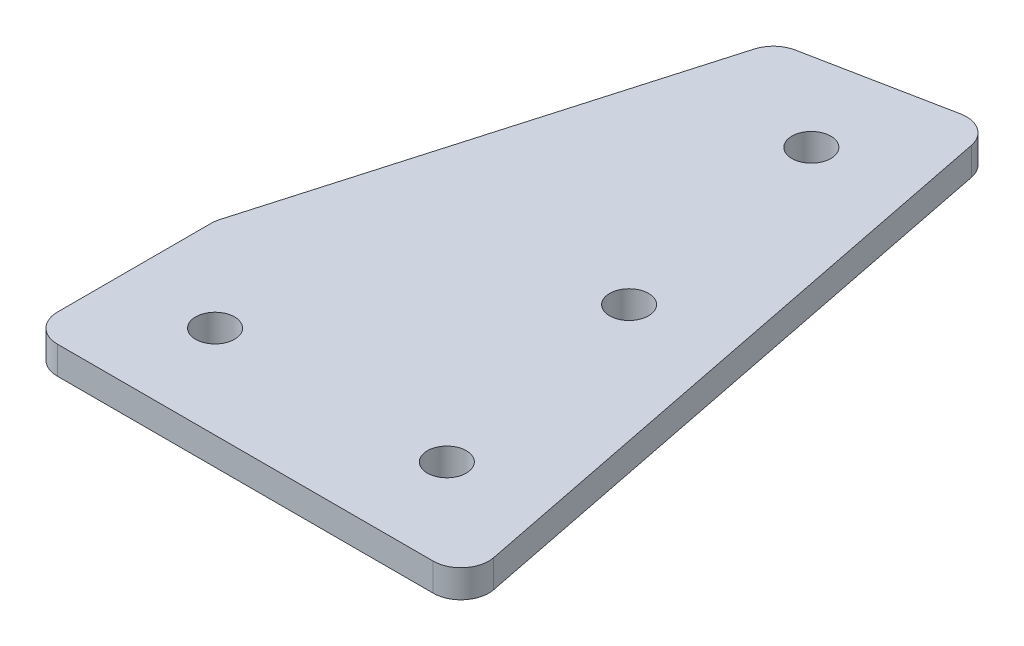
ISO-10303-21;
HEADER;
FILE_DESCRIPTION(('STEP AP214'),'2;1');
FILE_NAME('part.step','',(''),(''),'','','');
FILE_SCHEMA(('AUTOMOTIVE_DESIGN { 1 0 10303 214 1 1 1 1 }'));
ENDSEC;
DATA;
#1=APPLICATION_CONTEXT('core data for automotive mechanical design processes');
#2=APPLICATION_PROTOCOL_DEFINITION('international standard','automotive_design',2000,#1);
#3=PRODUCT_CONTEXT('',#1,'mechanical');
#4=PRODUCT('Part','Part','',(#3));
#5=PRODUCT_RELATED_PRODUCT_CATEGORY('part','',(#4));
#6=PRODUCT_DEFINITION_FORMATION('','',#4);
#7=PRODUCT_DEFINITION_CONTEXT('part definition',#1,'design');
#8=PRODUCT_DEFINITION('design','',#6,#7);
#9=PRODUCT_DEFINITION_SHAPE('','',#8);
#10=(LENGTH_UNIT() NAMED_UNIT(*) SI_UNIT(.MILLI.,.METRE.));
#11=(NAMED_UNIT(*) PLANE_ANGLE_UNIT() SI_UNIT($,.RADIAN.));
#12=(NAMED_UNIT(*) SI_UNIT($,.STERADIAN.) SOLID_ANGLE_UNIT());
#13=UNCERTAINTY_MEASURE_WITH_UNIT(LENGTH_MEASURE(1.E-05),#10,'distance_accuracy_value','');
#14=(GEOMETRIC_REPRESENTATION_CONTEXT(3) GLOBAL_UNCERTAINTY_ASSIGNED_CONTEXT((#13)) GLOBAL_UNIT_ASSIGNED_CONTEXT((#10,
#11,#12)) REPRESENTATION_CONTEXT('',''));
#15=CARTESIAN_POINT('',(0.,0.,0.));
#16=DIRECTION('',(0.,0.,1.));
#17=DIRECTION('',(1.,0.,0.));
#18=AXIS2_PLACEMENT_3D('',#15,#16,#17);
#19=CARTESIAN_POINT('',(9.80887295008376,3.,-1.94576757325093));
#20=DIRECTION('',(-0.980887295008377,0.,0.194576757325094));
#21=DIRECTION('',(0.194576757325094,0.,0.980887295008377));
#22=AXIS2_PLACEMENT_3D('',#19,#20,#21);
#23=PLANE('',#22);
#24=DIRECTION('',(-0.194576757325094,0.,-0.980887295008377));
#25=VECTOR('',#24,1.);
#26=CARTESIAN_POINT('',(9.80887295008376,3.,-1.94576757325093));
#27=LINE('',#26,#25);
#28=CARTESIAN_POINT('',(11.4676344724254,3.,6.41626972802472));
#29=VERTEX_POINT('',#28);
#30=CARTESIAN_POINT('',(-1.28200221744658,3.,-57.8563433887284));
#31=VERTEX_POINT('',#30);
#32=EDGE_CURVE('E138',#29,#31,#27,.T.);
#33=ORIENTED_EDGE('',*,*,#32,.F.);
#34=DIRECTION('',(0.,-1.,0.));
#35=VECTOR('',#34,1.);
#36=CARTESIAN_POINT('',(11.4676344724254,3.,6.41626972802472));
#37=LINE('',#36,#35);
#38=CARTESIAN_POINT('',(11.4676344724254,0.,6.41626972802472));
#39=VERTEX_POINT('',#38);
#40=EDGE_CURVE('E123',#29,#39,#37,.T.);
#41=ORIENTED_EDGE('',*,*,#40,.T.);
#42=DIRECTION('',(-0.194576757325094,0.,-0.980887295008377));
#43=VECTOR('',#42,1.);
#44=CARTESIAN_POINT('',(9.80887295008376,0.,-1.94576757325093));
#45=LINE('',#44,#43);
#46=CARTESIAN_POINT('',(-1.28200221744658,0.,-57.8563433887284));
#47=VERTEX_POINT('',#46);
#48=EDGE_CURVE('E135',#39,#47,#45,.T.);
#49=ORIENTED_EDGE('',*,*,#48,.T.);
#50=DIRECTION('',(0.,-1.,0.));
#51=VECTOR('',#50,1.);
#52=CARTESIAN_POINT('',(-1.28200221744658,3.,-57.8563433887284));
#53=LINE('',#52,#51);
#54=EDGE_CURVE('E140',#47,#31,#53,.F.);
#55=ORIENTED_EDGE('',*,*,#54,.T.);
#56=EDGE_LOOP('',(#33,#41,#49,#55));
#57=FACE_BOUND('',#56,.T.);
#58=ADVANCED_FACE('F41',(#57),#23,.F.);
#59=CARTESIAN_POINT('',(-11.6746054395056,3.,-58.8532377005026));
#60=DIRECTION('',(0.194576757325094,0.,0.980887295008377));
#61=DIRECTION('',(0.980887295008377,0.,-0.194576757325094));
#62=AXIS2_PLACEMENT_3D('',#59,#60,#61);
#63=PLANE('',#62);
#64=DIRECTION('',(-0.980887295008377,0.,0.194576757325094));
#65=VECTOR('',#64,1.);
#66=CARTESIAN_POINT('',(-11.6746054395056,0.,-58.8532377005026));
#67=LINE('',#66,#65);
#68=CARTESIAN_POINT('',(-4.808394374447,0.,-60.2152750017783));
#69=VERTEX_POINT('',#68);
#70=CARTESIAN_POINT('',(-19.6905986844829,0.,-57.2631202830533));
#71=VERTEX_POINT('',#70);
#72=EDGE_CURVE('E145',#69,#71,#67,.T.);
#73=ORIENTED_EDGE('',*,*,#72,.T.);
#74=DIRECTION('',(0.,-1.,0.));
#75=VECTOR('',#74,1.);
#76=CARTESIAN_POINT('',(-19.6905986844829,3.,-57.2631202830533));
#77=LINE('',#76,#75);
#78=CARTESIAN_POINT('',(-19.6905986844829,3.,-57.2631202830533));
#79=VERTEX_POINT('',#78);
#80=EDGE_CURVE('E11',#71,#79,#77,.F.);
#81=ORIENTED_EDGE('',*,*,#80,.T.);
#82=DIRECTION('',(-0.980887295008377,0.,0.194576757325094));
#83=VECTOR('',#82,1.);
#84=CARTESIAN_POINT('',(-11.6746054395056,3.,-58.8532377005026));
#85=LINE('',#84,#83);
#86=CARTESIAN_POINT('',(-4.808394374447,3.,-60.2152750017783));
#87=VERTEX_POINT('',#86);
#88=EDGE_CURVE('E204',#87,#79,#85,.T.);
#89=ORIENTED_EDGE('',*,*,#88,.F.);
#90=DIRECTION('',(0.,-1.,0.));
#91=VECTOR('',#90,1.);
#92=CARTESIAN_POINT('',(-4.808394374447,3.,-60.2152750017783));
#93=LINE('',#92,#91);
#94=EDGE_CURVE('E49',#87,#69,#93,.T.);
#95=ORIENTED_EDGE('',*,*,#94,.T.);
#96=EDGE_LOOP('',(#73,#81,#89,#95));
#97=FACE_BOUND('',#96,.T.);
#98=ADVANCED_FACE('F201',(#97),#63,.F.);
#99=CARTESIAN_POINT('',(-34.9772916586416,3.,-10.0788065801698));
#100=DIRECTION('',(0.960902540461166,0.,0.276886813942587));
#101=DIRECTION('',(0.276886813942587,0.,-0.960902540461166));
#102=AXIS2_PLACEMENT_3D('',#99,#100,#101);
#103=PLANE('',#102);
#104=DIRECTION('',(-0.276886813942587,0.,0.960902540461166));
#105=VECTOR('',#104,1.);
#106=CARTESIAN_POINT('',(-34.9772916586416,0.,-10.0788065801698));
#107=LINE('',#106,#105);
#108=CARTESIAN_POINT('',(-21.9895760338912,0.,-55.151118839856));
#109=VERTEX_POINT('',#108);
#110=CARTESIAN_POINT('',(-34.8827076213835,0.,-10.407049158407));
#111=VERTEX_POINT('',#110);
#112=EDGE_CURVE('E149',#109,#111,#107,.T.);
#113=ORIENTED_EDGE('',*,*,#112,.T.);
#114=DIRECTION('',(0.,-1.,0.));
#115=VECTOR('',#114,1.);
#116=CARTESIAN_POINT('',(-34.8827076213835,3.,-10.407049158407));
#117=LINE('',#116,#115);
#118=CARTESIAN_POINT('',(-34.8827076213835,3.,-10.407049158407));
#119=VERTEX_POINT('',#118);
#120=EDGE_CURVE('E196',#111,#119,#117,.F.);
#121=ORIENTED_EDGE('',*,*,#120,.T.);
#122=DIRECTION('',(-0.276886813942587,0.,0.960902540461166));
#123=VECTOR('',#122,1.);
#124=CARTESIAN_POINT('',(-34.9772916586416,3.,-10.0788065801698));
#125=LINE('',#124,#123);
#126=CARTESIAN_POINT('',(-21.9895760338912,3.,-55.151118839856));
#127=VERTEX_POINT('',#126);
#128=EDGE_CURVE('E216',#127,#119,#125,.T.);
#129=ORIENTED_EDGE('',*,*,#128,.F.);
#130=DIRECTION('',(0.,-1.,0.));
#131=VECTOR('',#130,1.);
#132=CARTESIAN_POINT('',(-21.9895760338912,3.,-55.151118839856));
#133=LINE('',#132,#131);
#134=EDGE_CURVE('E193',#127,#109,#133,.T.);
#135=ORIENTED_EDGE('',*,*,#134,.T.);
#136=EDGE_LOOP('',(#113,#121,#129,#135));
#137=FACE_BOUND('',#136,.T.);
#138=ADVANCED_FACE('F214',(#137),#103,.F.);
#139=CARTESIAN_POINT('',(-35.,3.,0.));
#140=DIRECTION('',(1.,0.,0.));
#141=DIRECTION('',(0.,0.,-1.));
#142=AXIS2_PLACEMENT_3D('',#139,#140,#141);
#143=PLANE('',#142);
#144=DIRECTION('',(0.,0.,1.));
#145=VECTOR('',#144,1.);
#146=CARTESIAN_POINT('',(-35.,0.,0.));
#147=LINE('',#146,#145);
#148=CARTESIAN_POINT('',(-35.,0.,-9.57638871657927));
#149=VERTEX_POINT('',#148);
#150=CARTESIAN_POINT('',(-35.,0.,7.));
#151=VERTEX_POINT('',#150);
#152=EDGE_CURVE('E158',#149,#151,#147,.T.);
#153=ORIENTED_EDGE('',*,*,#152,.T.);
#154=DIRECTION('',(0.,-1.,0.));
#155=VECTOR('',#154,1.);
#156=CARTESIAN_POINT('',(-35.,3.,7.));
#157=LINE('',#156,#155);
#158=CARTESIAN_POINT('',(-35.,3.,7.));
#159=VERTEX_POINT('',#158);
#160=EDGE_CURVE('E56',#151,#159,#157,.F.);
#161=ORIENTED_EDGE('',*,*,#160,.T.);
#162=DIRECTION('',(0.,0.,1.));
#163=VECTOR('',#162,1.);
#164=CARTESIAN_POINT('',(-35.,3.,0.));
#165=LINE('',#164,#163);
#166=CARTESIAN_POINT('',(-35.,3.,-9.57638871657927));
#167=VERTEX_POINT('',#166);
#168=EDGE_CURVE('E217',#167,#159,#165,.T.);
#169=ORIENTED_EDGE('',*,*,#168,.F.);
#170=DIRECTION('',(0.,-1.,0.));
#171=VECTOR('',#170,1.);
#172=CARTESIAN_POINT('',(-35.,3.,-9.57638871657927));
#173=LINE('',#172,#171);
#174=EDGE_CURVE('E189',#167,#149,#173,.T.);
#175=ORIENTED_EDGE('',*,*,#174,.T.);
#176=EDGE_LOOP('',(#153,#161,#169,#175));
#177=FACE_BOUND('',#176,.T.);
#178=ADVANCED_FACE('F262',(#177),#143,.F.);
#179=CARTESIAN_POINT('',(-25.,3.,0.));
#180=DIRECTION('',(0.,-1.,0.));
#181=DIRECTION('',(0.,0.,-1.));
#182=AXIS2_PLACEMENT_3D('',#179,#180,#181);
#183=CYLINDRICAL_SURFACE('',#182,2.1);
#184=CARTESIAN_POINT('',(-25.,3.,0.));
#185=DIRECTION('',(0.,1.,0.));
#186=DIRECTION('',(0.,0.,1.));
#187=AXIS2_PLACEMENT_3D('',#184,#185,#186);
#188=CIRCLE('',#187,2.1);
#189=CARTESIAN_POINT('',(-25.,3.,2.1));
#190=VERTEX_POINT('',#189);
#191=EDGE_CURVE('E226',#190,#190,#188,.T.);
#192=ORIENTED_EDGE('',*,*,#191,.T.);
#193=EDGE_LOOP('',(#192));
#194=FACE_BOUND('',#193,.T.);
#195=CARTESIAN_POINT('',(-25.,0.,0.));
#196=DIRECTION('',(0.,1.,0.));
#197=DIRECTION('',(0.,0.,1.));
#198=AXIS2_PLACEMENT_3D('',#195,#196,#197);
#199=CIRCLE('',#198,2.1);
#200=CARTESIAN_POINT('',(-25.,0.,2.1));
#201=VERTEX_POINT('',#200);
#202=EDGE_CURVE('E162',#201,#201,#199,.T.);
#203=ORIENTED_EDGE('',*,*,#202,.F.);
#204=EDGE_LOOP('',(#203));
#205=FACE_BOUND('',#204,.T.);
#206=ADVANCED_FACE('F265',(#194,#205),#183,.F.);
#207=CARTESIAN_POINT('',(0.,3.,10.));
#208=DIRECTION('',(0.,0.,-1.));
#209=DIRECTION('',(-1.,0.,0.));
#210=AXIS2_PLACEMENT_3D('',#207,#208,#209);
#211=PLANE('',#210);
#212=DIRECTION('',(1.,0.,0.));
#213=VECTOR('',#212,1.);
#214=CARTESIAN_POINT('',(0.,0.,10.));
#215=LINE('',#214,#213);
#216=CARTESIAN_POINT('',(-32.,0.,10.));
#217=VERTEX_POINT('',#216);
#218=CARTESIAN_POINT('',(8.52497258740029,0.,10.));
#219=VERTEX_POINT('',#218);
#220=EDGE_CURVE('E160',#217,#219,#215,.T.);
#221=ORIENTED_EDGE('',*,*,#220,.T.);
#222=DIRECTION('',(0.,-1.,0.));
#223=VECTOR('',#222,1.);
#224=CARTESIAN_POINT('',(8.52497258740029,3.,10.));
#225=LINE('',#224,#223);
#226=CARTESIAN_POINT('',(8.52497258740029,3.,10.));
#227=VERTEX_POINT('',#226);
#228=EDGE_CURVE('E124',#219,#227,#225,.F.);
#229=ORIENTED_EDGE('',*,*,#228,.T.);
#230=DIRECTION('',(1.,0.,0.));
#231=VECTOR('',#230,1.);
#232=CARTESIAN_POINT('',(0.,3.,10.));
#233=LINE('',#232,#231);
#234=CARTESIAN_POINT('',(-32.,3.,10.));
#235=VERTEX_POINT('',#234);
#236=EDGE_CURVE('E219',#235,#227,#233,.T.);
#237=ORIENTED_EDGE('',*,*,#236,.F.);
#238=DIRECTION('',(0.,-1.,0.));
#239=VECTOR('',#238,1.);
#240=CARTESIAN_POINT('',(-32.,3.,10.));
#241=LINE('',#240,#239);
#242=EDGE_CURVE('E129',#235,#217,#241,.T.);
#243=ORIENTED_EDGE('',*,*,#242,.T.);
#244=EDGE_LOOP('',(#221,#229,#237,#243));
#245=FACE_BOUND('',#244,.T.);
#246=ADVANCED_FACE('F248',(#245),#211,.F.);
#247=CARTESIAN_POINT('',(-4.86441893312735,3.,-24.5221823752094));
#248=DIRECTION('',(0.,-1.,0.));
#249=DIRECTION('',(0.,0.,-1.));
#250=AXIS2_PLACEMENT_3D('',#247,#248,#249);
#251=CYLINDRICAL_SURFACE('',#250,2.1);
#252=CARTESIAN_POINT('',(-4.86441893312735,3.,-24.5221823752094));
#253=DIRECTION('',(0.,1.,0.));
#254=DIRECTION('',(0.,0.,1.));
#255=AXIS2_PLACEMENT_3D('',#252,#253,#254);
#256=CIRCLE('',#255,2.1);
#257=CARTESIAN_POINT('',(-4.86441893312735,3.,-22.4221823752094));
#258=VERTEX_POINT('',#257);
#259=EDGE_CURVE('E282',#258,#258,#256,.T.);
#260=ORIENTED_EDGE('',*,*,#259,.T.);
#261=EDGE_LOOP('',(#260));
#262=FACE_BOUND('',#261,.T.);
#263=CARTESIAN_POINT('',(-4.86441893312735,0.,-24.5221823752094));
#264=DIRECTION('',(0.,1.,0.));
#265=DIRECTION('',(0.,0.,1.));
#266=AXIS2_PLACEMENT_3D('',#263,#264,#265);
#267=CIRCLE('',#266,2.1);
#268=CARTESIAN_POINT('',(-4.86441893312735,0.,-22.4221823752094));
#269=VERTEX_POINT('',#268);
#270=EDGE_CURVE('E146',#269,#269,#267,.T.);
#271=ORIENTED_EDGE('',*,*,#270,.F.);
#272=EDGE_LOOP('',(#271));
#273=FACE_BOUND('',#272,.T.);
#274=ADVANCED_FACE('F238',(#262,#273),#251,.F.);
#275=CARTESIAN_POINT('',(-9.7288378662547,3.,-49.0443647504189));
#276=DIRECTION('',(0.,-1.,0.));
#277=DIRECTION('',(0.,0.,-1.));
#278=AXIS2_PLACEMENT_3D('',#275,#276,#277);
#279=CYLINDRICAL_SURFACE('',#278,2.1);
#280=CARTESIAN_POINT('',(-9.7288378662547,3.,-49.0443647504189));
#281=DIRECTION('',(0.,1.,0.));
#282=DIRECTION('',(0.,0.,1.));
#283=AXIS2_PLACEMENT_3D('',#280,#281,#282);
#284=CIRCLE('',#283,2.1);
#285=CARTESIAN_POINT('',(-9.7288378662547,3.,-46.9443647504189));
#286=VERTEX_POINT('',#285);
#287=EDGE_CURVE('E168',#286,#286,#284,.T.);
#288=ORIENTED_EDGE('',*,*,#287,.T.);
#289=EDGE_LOOP('',(#288));
#290=FACE_BOUND('',#289,.T.);
#291=CARTESIAN_POINT('',(-9.7288378662547,0.,-49.0443647504189));
#292=DIRECTION('',(0.,1.,0.));
#293=DIRECTION('',(0.,0.,1.));
#294=AXIS2_PLACEMENT_3D('',#291,#292,#293);
#295=CIRCLE('',#294,2.1);
#296=CARTESIAN_POINT('',(-9.7288378662547,0.,-46.9443647504189));
#297=VERTEX_POINT('',#296);
#298=EDGE_CURVE('E152',#297,#297,#295,.T.);
#299=ORIENTED_EDGE('',*,*,#298,.F.);
#300=EDGE_LOOP('',(#299));
#301=FACE_BOUND('',#300,.T.);
#302=ADVANCED_FACE('F235',(#290,#301),#279,.F.);
#303=CARTESIAN_POINT('',(0.,3.,0.));
#304=DIRECTION('',(0.,-1.,0.));
#305=DIRECTION('',(0.,0.,-1.));
#306=AXIS2_PLACEMENT_3D('',#303,#304,#305);
#307=CYLINDRICAL_SURFACE('',#306,2.1);
#308=CARTESIAN_POINT('',(0.,3.,0.));
#309=DIRECTION('',(0.,1.,0.));
#310=DIRECTION('',(0.,0.,1.));
#311=AXIS2_PLACEMENT_3D('',#308,#309,#310);
#312=CIRCLE('',#311,2.1);
#313=CARTESIAN_POINT('',(0.,3.,2.1));
#314=VERTEX_POINT('',#313);
#315=EDGE_CURVE('E169',#314,#314,#312,.T.);
#316=ORIENTED_EDGE('',*,*,#315,.T.);
#317=EDGE_LOOP('',(#316));
#318=FACE_BOUND('',#317,.T.);
#319=CARTESIAN_POINT('',(0.,0.,0.));
#320=DIRECTION('',(0.,1.,0.));
#321=DIRECTION('',(0.,0.,1.));
#322=AXIS2_PLACEMENT_3D('',#319,#320,#321);
#323=CIRCLE('',#322,2.1);
#324=CARTESIAN_POINT('',(0.,0.,2.1));
#325=VERTEX_POINT('',#324);
#326=EDGE_CURVE('E165',#325,#325,#323,.T.);
#327=ORIENTED_EDGE('',*,*,#326,.F.);
#328=EDGE_LOOP('',(#327));
#329=FACE_BOUND('',#328,.T.);
#330=ADVANCED_FACE('F237',(#318,#329),#307,.F.);
#331=CARTESIAN_POINT('',(0.,3.,0.));
#332=DIRECTION('',(0.,1.,0.));
#333=DIRECTION('',(0.,0.,1.));
#334=AXIS2_PLACEMENT_3D('',#331,#332,#333);
#335=PLANE('',#334);
#336=ORIENTED_EDGE('',*,*,#287,.F.);
#337=EDGE_LOOP('',(#336));
#338=FACE_BOUND('',#337,.T.);
#339=ORIENTED_EDGE('',*,*,#259,.F.);
#340=EDGE_LOOP('',(#339));
#341=FACE_BOUND('',#340,.T.);
#342=ORIENTED_EDGE('',*,*,#236,.T.);
#343=CARTESIAN_POINT('',(8.52497258740029,3.,7.));
#344=DIRECTION('',(0.,1.,0.));
#345=DIRECTION('',(0.,0.,1.));
#346=AXIS2_PLACEMENT_3D('',#343,#344,#345);
#347=CIRCLE('',#346,3.);
#348=EDGE_CURVE('E187',#227,#29,#347,.T.);
#349=ORIENTED_EDGE('',*,*,#348,.T.);
#350=ORIENTED_EDGE('',*,*,#32,.T.);
#351=CARTESIAN_POINT('',(-4.22466410247172,3.,-57.2726131167532));
#352=DIRECTION('',(0.,1.,0.));
#353=DIRECTION('',(0.,0.,1.));
#354=AXIS2_PLACEMENT_3D('',#351,#352,#353);
#355=CIRCLE('',#354,3.);
#356=EDGE_CURVE('E180',#31,#87,#355,.T.);
#357=ORIENTED_EDGE('',*,*,#356,.T.);
#358=ORIENTED_EDGE('',*,*,#88,.T.);
#359=CARTESIAN_POINT('',(-19.1068684125077,3.,-54.3204583980282));
#360=DIRECTION('',(0.,1.,0.));
#361=DIRECTION('',(0.,0.,1.));
#362=AXIS2_PLACEMENT_3D('',#359,#360,#361);
#363=CIRCLE('',#362,3.);
#364=EDGE_CURVE('E182',#79,#127,#363,.T.);
#365=ORIENTED_EDGE('',*,*,#364,.T.);
#366=ORIENTED_EDGE('',*,*,#128,.T.);
#367=CARTESIAN_POINT('',(-32.,3.,-9.57638871657927));
#368=DIRECTION('',(0.,1.,0.));
#369=DIRECTION('',(0.,0.,1.));
#370=AXIS2_PLACEMENT_3D('',#367,#368,#369);
#371=CIRCLE('',#370,3.);
#372=EDGE_CURVE('E63',#119,#167,#371,.T.);
#373=ORIENTED_EDGE('',*,*,#372,.T.);
#374=ORIENTED_EDGE('',*,*,#168,.T.);
#375=CARTESIAN_POINT('',(-32.,3.,7.));
#376=DIRECTION('',(0.,1.,0.));
#377=DIRECTION('',(0.,0.,1.));
#378=AXIS2_PLACEMENT_3D('',#375,#376,#377);
#379=CIRCLE('',#378,3.);
#380=EDGE_CURVE('E185',#159,#235,#379,.T.);
#381=ORIENTED_EDGE('',*,*,#380,.T.);
#382=EDGE_LOOP('',(#342,#349,#350,#357,#358,#365,#366,#373,#374,#381));
#383=FACE_BOUND('',#382,.T.);
#384=ORIENTED_EDGE('',*,*,#191,.F.);
#385=EDGE_LOOP('',(#384));
#386=FACE_BOUND('',#385,.T.);
#387=ORIENTED_EDGE('',*,*,#315,.F.);
#388=EDGE_LOOP('',(#387));
#389=FACE_BOUND('',#388,.T.);
#390=ADVANCED_FACE('F245',(#338,#341,#383,#386,#389),#335,.T.);
#391=CARTESIAN_POINT('',(0.,0.,0.));
#392=DIRECTION('',(0.,1.,0.));
#393=DIRECTION('',(0.,0.,1.));
#394=AXIS2_PLACEMENT_3D('',#391,#392,#393);
#395=PLANE('',#394);
#396=ORIENTED_EDGE('',*,*,#298,.T.);
#397=EDGE_LOOP('',(#396));
#398=FACE_BOUND('',#397,.T.);
#399=ORIENTED_EDGE('',*,*,#270,.T.);
#400=EDGE_LOOP('',(#399));
#401=FACE_BOUND('',#400,.T.);
#402=ORIENTED_EDGE('',*,*,#48,.F.);
#403=CARTESIAN_POINT('',(8.52497258740029,0.,7.));
#404=DIRECTION('',(0.,1.,0.));
#405=DIRECTION('',(0.,0.,1.));
#406=AXIS2_PLACEMENT_3D('',#403,#404,#405);
#407=CIRCLE('',#406,3.);
#408=EDGE_CURVE('E119',#39,#219,#407,.F.);
#409=ORIENTED_EDGE('',*,*,#408,.T.);
#410=ORIENTED_EDGE('',*,*,#220,.F.);
#411=CARTESIAN_POINT('',(-32.,0.,7.));
#412=DIRECTION('',(0.,1.,0.));
#413=DIRECTION('',(0.,0.,1.));
#414=AXIS2_PLACEMENT_3D('',#411,#412,#413);
#415=CIRCLE('',#414,3.);
#416=EDGE_CURVE('E130',#217,#151,#415,.F.);
#417=ORIENTED_EDGE('',*,*,#416,.T.);
#418=ORIENTED_EDGE('',*,*,#152,.F.);
#419=CARTESIAN_POINT('',(-32.,0.,-9.57638871657927));
#420=DIRECTION('',(0.,1.,0.));
#421=DIRECTION('',(0.,0.,1.));
#422=AXIS2_PLACEMENT_3D('',#419,#420,#421);
#423=CIRCLE('',#422,3.);
#424=EDGE_CURVE('E174',#149,#111,#423,.F.);
#425=ORIENTED_EDGE('',*,*,#424,.T.);
#426=ORIENTED_EDGE('',*,*,#112,.F.);
#427=CARTESIAN_POINT('',(-19.1068684125077,0.,-54.3204583980282));
#428=DIRECTION('',(0.,1.,0.));
#429=DIRECTION('',(0.,0.,1.));
#430=AXIS2_PLACEMENT_3D('',#427,#428,#429);
#431=CIRCLE('',#430,3.);
#432=EDGE_CURVE('E172',#109,#71,#431,.F.);
#433=ORIENTED_EDGE('',*,*,#432,.T.);
#434=ORIENTED_EDGE('',*,*,#72,.F.);
#435=CARTESIAN_POINT('',(-4.22466410247172,0.,-57.2726131167532));
#436=DIRECTION('',(0.,1.,0.));
#437=DIRECTION('',(0.,0.,1.));
#438=AXIS2_PLACEMENT_3D('',#435,#436,#437);
#439=CIRCLE('',#438,3.);
#440=EDGE_CURVE('E139',#69,#47,#439,.F.);
#441=ORIENTED_EDGE('',*,*,#440,.T.);
#442=EDGE_LOOP('',(#402,#409,#410,#417,#418,#425,#426,#433,#434,#441));
#443=FACE_BOUND('',#442,.T.);
#444=ORIENTED_EDGE('',*,*,#202,.T.);
#445=EDGE_LOOP('',(#444));
#446=FACE_BOUND('',#445,.T.);
#447=ORIENTED_EDGE('',*,*,#326,.T.);
#448=EDGE_LOOP('',(#447));
#449=FACE_BOUND('',#448,.T.);
#450=ADVANCED_FACE('F142',(#398,#401,#443,#446,#449),#395,.F.);
#451=CARTESIAN_POINT('',(8.52497258740029,3.,7.));
#452=DIRECTION('',(0.,-1.,0.));
#453=DIRECTION('',(0.,0.,-1.));
#454=AXIS2_PLACEMENT_3D('',#451,#452,#453);
#455=CYLINDRICAL_SURFACE('',#454,3.);
#456=ORIENTED_EDGE('',*,*,#348,.F.);
#457=ORIENTED_EDGE('',*,*,#228,.F.);
#458=ORIENTED_EDGE('',*,*,#408,.F.);
#459=ORIENTED_EDGE('',*,*,#40,.F.);
#460=EDGE_LOOP('',(#456,#457,#458,#459));
#461=FACE_BOUND('',#460,.T.);
#462=ADVANCED_FACE('F122',(#461),#455,.T.);
#463=CARTESIAN_POINT('',(-32.,3.,7.));
#464=DIRECTION('',(0.,-1.,0.));
#465=DIRECTION('',(0.,0.,-1.));
#466=AXIS2_PLACEMENT_3D('',#463,#464,#465);
#467=CYLINDRICAL_SURFACE('',#466,3.);
#468=ORIENTED_EDGE('',*,*,#380,.F.);
#469=ORIENTED_EDGE('',*,*,#160,.F.);
#470=ORIENTED_EDGE('',*,*,#416,.F.);
#471=ORIENTED_EDGE('',*,*,#242,.F.);
#472=EDGE_LOOP('',(#468,#469,#470,#471));
#473=FACE_BOUND('',#472,.T.);
#474=ADVANCED_FACE('F296',(#473),#467,.T.);
#475=CARTESIAN_POINT('',(-32.,3.,-9.57638871657927));
#476=DIRECTION('',(0.,-1.,0.));
#477=DIRECTION('',(0.,0.,-1.));
#478=AXIS2_PLACEMENT_3D('',#475,#476,#477);
#479=CYLINDRICAL_SURFACE('',#478,3.);
#480=ORIENTED_EDGE('',*,*,#372,.F.);
#481=ORIENTED_EDGE('',*,*,#120,.F.);
#482=ORIENTED_EDGE('',*,*,#424,.F.);
#483=ORIENTED_EDGE('',*,*,#174,.F.);
#484=EDGE_LOOP('',(#480,#481,#482,#483));
#485=FACE_BOUND('',#484,.T.);
#486=ADVANCED_FACE('F300',(#485),#479,.T.);
#487=CARTESIAN_POINT('',(-19.1068684125077,3.,-54.3204583980282));
#488=DIRECTION('',(0.,-1.,0.));
#489=DIRECTION('',(0.,0.,-1.));
#490=AXIS2_PLACEMENT_3D('',#487,#488,#489);
#491=CYLINDRICAL_SURFACE('',#490,3.);
#492=ORIENTED_EDGE('',*,*,#364,.F.);
#493=ORIENTED_EDGE('',*,*,#80,.F.);
#494=ORIENTED_EDGE('',*,*,#432,.F.);
#495=ORIENTED_EDGE('',*,*,#134,.F.);
#496=EDGE_LOOP('',(#492,#493,#494,#495));
#497=FACE_BOUND('',#496,.T.);
#498=ADVANCED_FACE('F211',(#497),#491,.T.);
#499=CARTESIAN_POINT('',(-4.22466410247172,3.,-57.2726131167532));
#500=DIRECTION('',(0.,-1.,0.));
#501=DIRECTION('',(0.,0.,-1.));
#502=AXIS2_PLACEMENT_3D('',#499,#500,#501);
#503=CYLINDRICAL_SURFACE('',#502,3.);
#504=ORIENTED_EDGE('',*,*,#356,.F.);
#505=ORIENTED_EDGE('',*,*,#54,.F.);
#506=ORIENTED_EDGE('',*,*,#440,.F.);
#507=ORIENTED_EDGE('',*,*,#94,.F.);
#508=EDGE_LOOP('',(#504,#505,#506,#507));
#509=FACE_BOUND('',#508,.T.);
#510=ADVANCED_FACE('F43',(#509),#503,.T.);
#511=CLOSED_SHELL('',(#58,#98,#138,#178,#206,#246,#274,#302,#330,#390,#450,#462,#474,#486,#498,#510));
#512=MANIFOLD_SOLID_BREP('B2',#511);
#513=ADVANCED_BREP_SHAPE_REPRESENTATION('',(#18,#512),#14);
#514=SHAPE_DEFINITION_REPRESENTATION(#9,#513);
ENDSEC;
END-ISO-10303-21;
